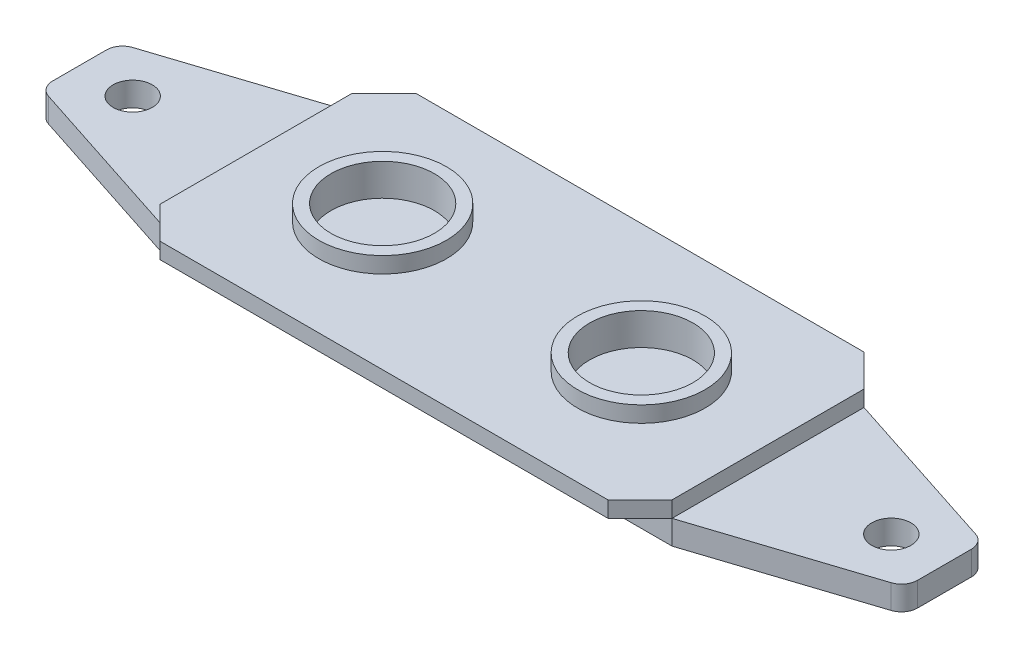
ISO-10303-21;
HEADER;
FILE_DESCRIPTION(('STEP AP214'),'2;1');
FILE_NAME('part.step','',(''),(''),'','','');
FILE_SCHEMA(('AUTOMOTIVE_DESIGN { 1 0 10303 214 1 1 1 1 }'));
ENDSEC;
DATA;
#1=APPLICATION_CONTEXT('core data for automotive mechanical design processes');
#2=APPLICATION_PROTOCOL_DEFINITION('international standard','automotive_design',2000,#1);
#3=PRODUCT_CONTEXT('',#1,'mechanical');
#4=PRODUCT('Part','Part','',(#3));
#5=PRODUCT_RELATED_PRODUCT_CATEGORY('part','',(#4));
#6=PRODUCT_DEFINITION_FORMATION('','',#4);
#7=PRODUCT_DEFINITION_CONTEXT('part definition',#1,'design');
#8=PRODUCT_DEFINITION('design','',#6,#7);
#9=PRODUCT_DEFINITION_SHAPE('','',#8);
#10=(LENGTH_UNIT() NAMED_UNIT(*) SI_UNIT(.MILLI.,.METRE.));
#11=(NAMED_UNIT(*) PLANE_ANGLE_UNIT() SI_UNIT($,.RADIAN.));
#12=(NAMED_UNIT(*) SI_UNIT($,.STERADIAN.) SOLID_ANGLE_UNIT());
#13=UNCERTAINTY_MEASURE_WITH_UNIT(LENGTH_MEASURE(1.E-05),#10,'distance_accuracy_value','');
#14=(GEOMETRIC_REPRESENTATION_CONTEXT(3) GLOBAL_UNCERTAINTY_ASSIGNED_CONTEXT((#13)) GLOBAL_UNIT_ASSIGNED_CONTEXT((#10,
#11,#12)) REPRESENTATION_CONTEXT('',''));
#15=CARTESIAN_POINT('',(0.,0.,0.));
#16=DIRECTION('',(0.,0.,1.));
#17=DIRECTION('',(1.,0.,0.));
#18=AXIS2_PLACEMENT_3D('',#15,#16,#17);
#19=CARTESIAN_POINT('',(0.,-3.175,-50.8));
#20=DIRECTION('',(0.,-1.,0.));
#21=DIRECTION('',(0.,0.,-1.));
#22=AXIS2_PLACEMENT_3D('',#19,#20,#21);
#23=PLANE('',#22);
#24=DIRECTION('',(-0.707106781186547,0.,-0.707106781186548));
#25=VECTOR('',#24,1.);
#26=CARTESIAN_POINT('',(95.25,-3.175,-50.8));
#27=LINE('',#26,#25);
#28=CARTESIAN_POINT('',(101.6,-3.175,-44.45));
#29=VERTEX_POINT('',#28);
#30=CARTESIAN_POINT('',(95.25,-3.175,-50.8));
#31=VERTEX_POINT('',#30);
#32=EDGE_CURVE('E120',#29,#31,#27,.T.);
#33=ORIENTED_EDGE('',*,*,#32,.F.);
#34=DIRECTION('',(-1.,0.,0.));
#35=VECTOR('',#34,1.);
#36=CARTESIAN_POINT('',(-86.0744696698032,-3.175,-44.45));
#37=LINE('',#36,#35);
#38=CARTESIAN_POINT('',(0.,-3.175,-44.45));
#39=VERTEX_POINT('',#38);
#40=EDGE_CURVE('E50',#29,#39,#37,.T.);
#41=ORIENTED_EDGE('',*,*,#40,.T.);
#42=DIRECTION('',(-0.707106781186547,0.,0.707106781186548));
#43=VECTOR('',#42,1.);
#44=CARTESIAN_POINT('',(0.,-3.175,-44.45));
#45=LINE('',#44,#43);
#46=CARTESIAN_POINT('',(6.35,-3.175,-50.8));
#47=VERTEX_POINT('',#46);
#48=EDGE_CURVE('E122',#47,#39,#45,.T.);
#49=ORIENTED_EDGE('',*,*,#48,.F.);
#50=DIRECTION('',(-1.,0.,0.));
#51=VECTOR('',#50,1.);
#52=CARTESIAN_POINT('',(6.35,-3.175,-50.8));
#53=LINE('',#52,#51);
#54=EDGE_CURVE('E112',#31,#47,#53,.T.);
#55=ORIENTED_EDGE('',*,*,#54,.F.);
#56=EDGE_LOOP('',(#33,#41,#49,#55));
#57=FACE_BOUND('',#56,.T.);
#58=ADVANCED_FACE('F33',(#57),#23,.T.);
#59=CARTESIAN_POINT('',(0.,0.,-50.8));
#60=DIRECTION('',(0.,-1.,0.));
#61=DIRECTION('',(0.,0.,-1.));
#62=AXIS2_PLACEMENT_3D('',#59,#60,#61);
#63=PLANE('',#62);
#64=DIRECTION('',(0.,0.,1.));
#65=VECTOR('',#64,1.);
#66=CARTESIAN_POINT('',(0.,0.,-6.35));
#67=LINE('',#66,#65);
#68=CARTESIAN_POINT('',(0.,0.,-44.45));
#69=VERTEX_POINT('',#68);
#70=CARTESIAN_POINT('',(0.,0.,-6.35));
#71=VERTEX_POINT('',#70);
#72=EDGE_CURVE('E133',#69,#71,#67,.T.);
#73=ORIENTED_EDGE('',*,*,#72,.T.);
#74=DIRECTION('',(0.707106781186547,0.,0.707106781186547));
#75=VECTOR('',#74,1.);
#76=CARTESIAN_POINT('',(0.,0.,-6.35));
#77=LINE('',#76,#75);
#78=CARTESIAN_POINT('',(6.35,0.,0.));
#79=VERTEX_POINT('',#78);
#80=EDGE_CURVE('E136',#71,#79,#77,.T.);
#81=ORIENTED_EDGE('',*,*,#80,.T.);
#82=DIRECTION('',(1.,0.,0.));
#83=VECTOR('',#82,1.);
#84=CARTESIAN_POINT('',(6.35,0.,0.));
#85=LINE('',#84,#83);
#86=CARTESIAN_POINT('',(95.25,0.,0.));
#87=VERTEX_POINT('',#86);
#88=EDGE_CURVE('E140',#79,#87,#85,.T.);
#89=ORIENTED_EDGE('',*,*,#88,.T.);
#90=DIRECTION('',(0.707106781186547,0.,-0.707106781186548));
#91=VECTOR('',#90,1.);
#92=CARTESIAN_POINT('',(95.25,0.,0.));
#93=LINE('',#92,#91);
#94=CARTESIAN_POINT('',(101.6,0.,-6.35));
#95=VERTEX_POINT('',#94);
#96=EDGE_CURVE('E143',#87,#95,#93,.T.);
#97=ORIENTED_EDGE('',*,*,#96,.T.);
#98=DIRECTION('',(0.,0.,-1.));
#99=VECTOR('',#98,1.);
#100=CARTESIAN_POINT('',(101.6,0.,-6.35));
#101=LINE('',#100,#99);
#102=CARTESIAN_POINT('',(101.6,0.,-44.45));
#103=VERTEX_POINT('',#102);
#104=EDGE_CURVE('E146',#95,#103,#101,.T.);
#105=ORIENTED_EDGE('',*,*,#104,.T.);
#106=DIRECTION('',(-0.707106781186547,0.,-0.707106781186548));
#107=VECTOR('',#106,1.);
#108=CARTESIAN_POINT('',(95.25,0.,-50.8));
#109=LINE('',#108,#107);
#110=CARTESIAN_POINT('',(95.25,0.,-50.8));
#111=VERTEX_POINT('',#110);
#112=EDGE_CURVE('E149',#103,#111,#109,.T.);
#113=ORIENTED_EDGE('',*,*,#112,.T.);
#114=DIRECTION('',(-1.,0.,0.));
#115=VECTOR('',#114,1.);
#116=CARTESIAN_POINT('',(6.35,0.,-50.8));
#117=LINE('',#116,#115);
#118=CARTESIAN_POINT('',(6.35,0.,-50.8));
#119=VERTEX_POINT('',#118);
#120=EDGE_CURVE('E113',#111,#119,#117,.T.);
#121=ORIENTED_EDGE('',*,*,#120,.T.);
#122=DIRECTION('',(-0.707106781186547,0.,0.707106781186548));
#123=VECTOR('',#122,1.);
#124=CARTESIAN_POINT('',(0.,0.,-44.45));
#125=LINE('',#124,#123);
#126=EDGE_CURVE('E152',#119,#69,#125,.T.);
#127=ORIENTED_EDGE('',*,*,#126,.T.);
#128=EDGE_LOOP('',(#73,#81,#89,#97,#105,#113,#121,#127));
#129=FACE_BOUND('',#128,.T.);
#130=CARTESIAN_POINT('',(25.1402808111057,0.,-25.4));
#131=DIRECTION('',(0.,-1.,0.));
#132=DIRECTION('',(0.,0.,-1.));
#133=AXIS2_PLACEMENT_3D('',#130,#131,#132);
#134=CIRCLE('',#133,12.6587947998545);
#135=CARTESIAN_POINT('',(25.1402808111057,0.,-38.0587947998545));
#136=VERTEX_POINT('',#135);
#137=EDGE_CURVE('E42',#136,#136,#134,.F.);
#138=ORIENTED_EDGE('',*,*,#137,.F.);
#139=EDGE_LOOP('',(#138));
#140=FACE_BOUND('',#139,.T.);
#141=CARTESIAN_POINT('',(76.4597191888943,0.,-25.4));
#142=DIRECTION('',(0.,-1.,0.));
#143=DIRECTION('',(0.,0.,-1.));
#144=AXIS2_PLACEMENT_3D('',#141,#142,#143);
#145=CIRCLE('',#144,12.6587947998545);
#146=CARTESIAN_POINT('',(76.4597191888943,0.,-38.0587947998545));
#147=VERTEX_POINT('',#146);
#148=EDGE_CURVE('E11',#147,#147,#145,.F.);
#149=ORIENTED_EDGE('',*,*,#148,.F.);
#150=EDGE_LOOP('',(#149));
#151=FACE_BOUND('',#150,.T.);
#152=ADVANCED_FACE('F169',(#129,#140,#151),#63,.F.);
#153=CARTESIAN_POINT('',(0.,-3.175,-6.35));
#154=DIRECTION('',(-1.,0.,0.));
#155=DIRECTION('',(0.,0.,1.));
#156=AXIS2_PLACEMENT_3D('',#153,#154,#155);
#157=PLANE('',#156);
#158=ORIENTED_EDGE('',*,*,#72,.F.);
#159=DIRECTION('',(0.,1.,0.));
#160=VECTOR('',#159,1.);
#161=CARTESIAN_POINT('',(0.,-3.175,-44.45));
#162=LINE('',#161,#160);
#163=EDGE_CURVE('E87',#39,#69,#162,.T.);
#164=ORIENTED_EDGE('',*,*,#163,.F.);
#165=DIRECTION('',(0.,0.,1.));
#166=VECTOR('',#165,1.);
#167=CARTESIAN_POINT('',(0.,-3.175,-6.35));
#168=LINE('',#167,#166);
#169=CARTESIAN_POINT('',(0.,-3.175,-6.35));
#170=VERTEX_POINT('',#169);
#171=EDGE_CURVE('E155',#39,#170,#168,.T.);
#172=ORIENTED_EDGE('',*,*,#171,.T.);
#173=DIRECTION('',(0.,1.,0.));
#174=VECTOR('',#173,1.);
#175=CARTESIAN_POINT('',(0.,-3.175,-6.35));
#176=LINE('',#175,#174);
#177=EDGE_CURVE('E132',#170,#71,#176,.T.);
#178=ORIENTED_EDGE('',*,*,#177,.T.);
#179=EDGE_LOOP('',(#158,#164,#172,#178));
#180=FACE_BOUND('',#179,.T.);
#181=ADVANCED_FACE('F35',(#180),#157,.T.);
#182=CARTESIAN_POINT('',(0.,-3.175,-44.45));
#183=DIRECTION('',(-0.707106781186548,0.,-0.707106781186547));
#184=DIRECTION('',(-0.707106781186547,0.,0.707106781186548));
#185=AXIS2_PLACEMENT_3D('',#182,#183,#184);
#186=PLANE('',#185);
#187=ORIENTED_EDGE('',*,*,#126,.F.);
#188=DIRECTION('',(0.,1.,0.));
#189=VECTOR('',#188,1.);
#190=CARTESIAN_POINT('',(6.35,-3.175,-50.8));
#191=LINE('',#190,#189);
#192=EDGE_CURVE('E80',#47,#119,#191,.T.);
#193=ORIENTED_EDGE('',*,*,#192,.F.);
#194=ORIENTED_EDGE('',*,*,#48,.T.);
#195=ORIENTED_EDGE('',*,*,#163,.T.);
#196=EDGE_LOOP('',(#187,#193,#194,#195));
#197=FACE_BOUND('',#196,.T.);
#198=ADVANCED_FACE('F575',(#197),#186,.T.);
#199=CARTESIAN_POINT('',(6.35,-3.175,-50.8));
#200=DIRECTION('',(0.,0.,-1.));
#201=DIRECTION('',(-1.,0.,0.));
#202=AXIS2_PLACEMENT_3D('',#199,#200,#201);
#203=PLANE('',#202);
#204=ORIENTED_EDGE('',*,*,#120,.F.);
#205=DIRECTION('',(0.,1.,0.));
#206=VECTOR('',#205,1.);
#207=CARTESIAN_POINT('',(95.25,-3.175,-50.8));
#208=LINE('',#207,#206);
#209=EDGE_CURVE('E109',#31,#111,#208,.T.);
#210=ORIENTED_EDGE('',*,*,#209,.F.);
#211=ORIENTED_EDGE('',*,*,#54,.T.);
#212=ORIENTED_EDGE('',*,*,#192,.T.);
#213=EDGE_LOOP('',(#204,#210,#211,#212));
#214=FACE_BOUND('',#213,.T.);
#215=ADVANCED_FACE('F111',(#214),#203,.T.);
#216=CARTESIAN_POINT('',(95.25,-3.175,-50.8));
#217=DIRECTION('',(0.707106781186548,0.,-0.707106781186547));
#218=DIRECTION('',(-0.707106781186547,0.,-0.707106781186548));
#219=AXIS2_PLACEMENT_3D('',#216,#217,#218);
#220=PLANE('',#219);
#221=ORIENTED_EDGE('',*,*,#112,.F.);
#222=DIRECTION('',(0.,1.,0.));
#223=VECTOR('',#222,1.);
#224=CARTESIAN_POINT('',(101.6,-3.175,-44.45));
#225=LINE('',#224,#223);
#226=EDGE_CURVE('E118',#29,#103,#225,.T.);
#227=ORIENTED_EDGE('',*,*,#226,.F.);
#228=ORIENTED_EDGE('',*,*,#32,.T.);
#229=ORIENTED_EDGE('',*,*,#209,.T.);
#230=EDGE_LOOP('',(#221,#227,#228,#229));
#231=FACE_BOUND('',#230,.T.);
#232=ADVANCED_FACE('F124',(#231),#220,.T.);
#233=CARTESIAN_POINT('',(101.6,-3.175,-6.35));
#234=DIRECTION('',(1.,0.,0.));
#235=DIRECTION('',(0.,0.,-1.));
#236=AXIS2_PLACEMENT_3D('',#233,#234,#235);
#237=PLANE('',#236);
#238=ORIENTED_EDGE('',*,*,#104,.F.);
#239=DIRECTION('',(0.,1.,0.));
#240=VECTOR('',#239,1.);
#241=CARTESIAN_POINT('',(101.6,-3.175,-6.35));
#242=LINE('',#241,#240);
#243=CARTESIAN_POINT('',(101.6,-3.175,-6.35));
#244=VERTEX_POINT('',#243);
#245=EDGE_CURVE('E159',#244,#95,#242,.T.);
#246=ORIENTED_EDGE('',*,*,#245,.F.);
#247=DIRECTION('',(0.,0.,-1.));
#248=VECTOR('',#247,1.);
#249=CARTESIAN_POINT('',(101.6,-3.175,-6.35));
#250=LINE('',#249,#248);
#251=EDGE_CURVE('E125',#244,#29,#250,.T.);
#252=ORIENTED_EDGE('',*,*,#251,.T.);
#253=ORIENTED_EDGE('',*,*,#226,.T.);
#254=EDGE_LOOP('',(#238,#246,#252,#253));
#255=FACE_BOUND('',#254,.T.);
#256=ADVANCED_FACE('F231',(#255),#237,.T.);
#257=CARTESIAN_POINT('',(95.25,-3.175,0.));
#258=DIRECTION('',(0.707106781186548,0.,0.707106781186547));
#259=DIRECTION('',(0.707106781186547,0.,-0.707106781186548));
#260=AXIS2_PLACEMENT_3D('',#257,#258,#259);
#261=PLANE('',#260);
#262=ORIENTED_EDGE('',*,*,#96,.F.);
#263=DIRECTION('',(0.,1.,0.));
#264=VECTOR('',#263,1.);
#265=CARTESIAN_POINT('',(95.25,-3.175,0.));
#266=LINE('',#265,#264);
#267=CARTESIAN_POINT('',(95.25,-3.175,0.));
#268=VERTEX_POINT('',#267);
#269=EDGE_CURVE('E161',#268,#87,#266,.T.);
#270=ORIENTED_EDGE('',*,*,#269,.F.);
#271=DIRECTION('',(0.707106781186547,0.,-0.707106781186548));
#272=VECTOR('',#271,1.);
#273=CARTESIAN_POINT('',(95.25,-3.175,0.));
#274=LINE('',#273,#272);
#275=EDGE_CURVE('E127',#268,#244,#274,.T.);
#276=ORIENTED_EDGE('',*,*,#275,.T.);
#277=ORIENTED_EDGE('',*,*,#245,.T.);
#278=EDGE_LOOP('',(#262,#270,#276,#277));
#279=FACE_BOUND('',#278,.T.);
#280=ADVANCED_FACE('F236',(#279),#261,.T.);
#281=CARTESIAN_POINT('',(6.35,-3.175,0.));
#282=DIRECTION('',(0.,0.,1.));
#283=DIRECTION('',(1.,0.,0.));
#284=AXIS2_PLACEMENT_3D('',#281,#282,#283);
#285=PLANE('',#284);
#286=ORIENTED_EDGE('',*,*,#88,.F.);
#287=DIRECTION('',(0.,1.,0.));
#288=VECTOR('',#287,1.);
#289=CARTESIAN_POINT('',(6.35,-3.175,0.));
#290=LINE('',#289,#288);
#291=CARTESIAN_POINT('',(6.35,-3.175,0.));
#292=VERTEX_POINT('',#291);
#293=EDGE_CURVE('E95',#292,#79,#290,.T.);
#294=ORIENTED_EDGE('',*,*,#293,.F.);
#295=DIRECTION('',(1.,0.,0.));
#296=VECTOR('',#295,1.);
#297=CARTESIAN_POINT('',(6.35,-3.175,0.));
#298=LINE('',#297,#296);
#299=EDGE_CURVE('E237',#292,#268,#298,.T.);
#300=ORIENTED_EDGE('',*,*,#299,.T.);
#301=ORIENTED_EDGE('',*,*,#269,.T.);
#302=EDGE_LOOP('',(#286,#294,#300,#301));
#303=FACE_BOUND('',#302,.T.);
#304=ADVANCED_FACE('F210',(#303),#285,.T.);
#305=CARTESIAN_POINT('',(0.,-3.175,-6.35));
#306=DIRECTION('',(-0.707106781186548,0.,0.707106781186548));
#307=DIRECTION('',(0.707106781186548,0.,0.707106781186548));
#308=AXIS2_PLACEMENT_3D('',#305,#306,#307);
#309=PLANE('',#308);
#310=ORIENTED_EDGE('',*,*,#80,.F.);
#311=ORIENTED_EDGE('',*,*,#177,.F.);
#312=DIRECTION('',(0.707106781186547,0.,0.707106781186547));
#313=VECTOR('',#312,1.);
#314=CARTESIAN_POINT('',(0.,-3.175,-6.35));
#315=LINE('',#314,#313);
#316=EDGE_CURVE('E220',#170,#292,#315,.T.);
#317=ORIENTED_EDGE('',*,*,#316,.T.);
#318=ORIENTED_EDGE('',*,*,#293,.T.);
#319=EDGE_LOOP('',(#310,#311,#317,#318));
#320=FACE_BOUND('',#319,.T.);
#321=ADVANCED_FACE('F202',(#320),#309,.T.);
#322=DIRECTION('',(-1.,0.,0.));
#323=VECTOR('',#322,1.);
#324=CARTESIAN_POINT('',(-86.0744696698032,-3.175,-6.35));
#325=LINE('',#324,#323);
#326=EDGE_CURVE('E215',#244,#170,#325,.T.);
#327=ORIENTED_EDGE('',*,*,#326,.F.);
#328=ORIENTED_EDGE('',*,*,#275,.F.);
#329=ORIENTED_EDGE('',*,*,#299,.F.);
#330=ORIENTED_EDGE('',*,*,#316,.F.);
#331=EDGE_LOOP('',(#327,#328,#329,#330));
#332=FACE_BOUND('',#331,.T.);
#333=ADVANCED_FACE('F196',(#332),#23,.T.);
#334=CARTESIAN_POINT('',(25.1402808111057,3.175,-25.4));
#335=DIRECTION('',(0.,1.,0.));
#336=DIRECTION('',(0.,0.,1.));
#337=AXIS2_PLACEMENT_3D('',#334,#335,#336);
#338=PLANE('',#337);
#339=CARTESIAN_POINT('',(25.1402808111057,3.175,-25.4));
#340=DIRECTION('',(0.,1.,0.));
#341=DIRECTION('',(0.,0.,1.));
#342=AXIS2_PLACEMENT_3D('',#339,#340,#341);
#343=CIRCLE('',#342,12.6587947998545);
#344=CARTESIAN_POINT('',(25.1402808111057,3.175,-12.7412052001455));
#345=VERTEX_POINT('',#344);
#346=EDGE_CURVE('E137',#345,#345,#343,.T.);
#347=ORIENTED_EDGE('',*,*,#346,.T.);
#348=EDGE_LOOP('',(#347));
#349=FACE_BOUND('',#348,.T.);
#350=CARTESIAN_POINT('',(25.1402808111057,3.175,-25.4));
#351=DIRECTION('',(0.,1.,0.));
#352=DIRECTION('',(0.,0.,1.));
#353=AXIS2_PLACEMENT_3D('',#350,#351,#352);
#354=CIRCLE('',#353,10.2638876755577);
#355=CARTESIAN_POINT('',(25.1402808111057,3.175,-15.1361123244423));
#356=VERTEX_POINT('',#355);
#357=EDGE_CURVE('E306',#356,#356,#354,.T.);
#358=ORIENTED_EDGE('',*,*,#357,.F.);
#359=EDGE_LOOP('',(#358));
#360=FACE_BOUND('',#359,.T.);
#361=ADVANCED_FACE('F201',(#349,#360),#338,.T.);
#362=CARTESIAN_POINT('',(25.1402808111057,3.175,-25.4));
#363=DIRECTION('',(0.,-1.,0.));
#364=DIRECTION('',(0.,0.,-1.));
#365=AXIS2_PLACEMENT_3D('',#362,#363,#364);
#366=CYLINDRICAL_SURFACE('',#365,12.6587947998545);
#367=ORIENTED_EDGE('',*,*,#346,.F.);
#368=EDGE_LOOP('',(#367));
#369=FACE_BOUND('',#368,.T.);
#370=ORIENTED_EDGE('',*,*,#137,.T.);
#371=EDGE_LOOP('',(#370));
#372=FACE_BOUND('',#371,.T.);
#373=ADVANCED_FACE('F167',(#369,#372),#366,.T.);
#374=CARTESIAN_POINT('',(25.1402808111057,3.175,-25.4));
#375=DIRECTION('',(0.,-1.,0.));
#376=DIRECTION('',(0.,0.,-1.));
#377=AXIS2_PLACEMENT_3D('',#374,#375,#376);
#378=CYLINDRICAL_SURFACE('',#377,10.2638876755577);
#379=ORIENTED_EDGE('',*,*,#357,.T.);
#380=EDGE_LOOP('',(#379));
#381=FACE_BOUND('',#380,.T.);
#382=CARTESIAN_POINT('',(25.1402808111057,-3.175,-25.4));
#383=DIRECTION('',(0.,1.,0.));
#384=DIRECTION('',(0.,0.,1.));
#385=AXIS2_PLACEMENT_3D('',#382,#383,#384);
#386=CIRCLE('',#385,10.2638876755577);
#387=CARTESIAN_POINT('',(25.1402808111057,-3.175,-15.1361123244423));
#388=VERTEX_POINT('',#387);
#389=EDGE_CURVE('E296',#388,#388,#386,.T.);
#390=ORIENTED_EDGE('',*,*,#389,.F.);
#391=EDGE_LOOP('',(#390));
#392=FACE_BOUND('',#391,.T.);
#393=ADVANCED_FACE('F189',(#381,#392),#378,.F.);
#394=CARTESIAN_POINT('',(76.4597191888943,3.175,-25.4));
#395=DIRECTION('',(0.,-1.,0.));
#396=DIRECTION('',(0.,0.,-1.));
#397=AXIS2_PLACEMENT_3D('',#394,#395,#396);
#398=PLANE('',#397);
#399=CARTESIAN_POINT('',(76.4597191888943,3.175,-25.4));
#400=DIRECTION('',(0.,1.,0.));
#401=DIRECTION('',(0.,0.,-1.));
#402=AXIS2_PLACEMENT_3D('',#399,#400,#401);
#403=CIRCLE('',#402,12.6587947998545);
#404=CARTESIAN_POINT('',(76.4597191888943,3.175,-38.0587947998545));
#405=VERTEX_POINT('',#404);
#406=EDGE_CURVE('E303',#405,#405,#403,.T.);
#407=ORIENTED_EDGE('',*,*,#406,.T.);
#408=EDGE_LOOP('',(#407));
#409=FACE_BOUND('',#408,.T.);
#410=CARTESIAN_POINT('',(76.4597191888943,3.175,-25.4));
#411=DIRECTION('',(0.,1.,0.));
#412=DIRECTION('',(0.,0.,-1.));
#413=AXIS2_PLACEMENT_3D('',#410,#411,#412);
#414=CIRCLE('',#413,10.2638876755577);
#415=CARTESIAN_POINT('',(76.4597191888943,3.175,-35.6638876755577));
#416=VERTEX_POINT('',#415);
#417=EDGE_CURVE('E300',#416,#416,#414,.T.);
#418=ORIENTED_EDGE('',*,*,#417,.F.);
#419=EDGE_LOOP('',(#418));
#420=FACE_BOUND('',#419,.T.);
#421=ADVANCED_FACE('F179',(#409,#420),#398,.F.);
#422=CARTESIAN_POINT('',(76.4597191888943,3.175,-25.4));
#423=DIRECTION('',(0.,-1.,0.));
#424=DIRECTION('',(0.,0.,-1.));
#425=AXIS2_PLACEMENT_3D('',#422,#423,#424);
#426=CYLINDRICAL_SURFACE('',#425,12.6587947998545);
#427=ORIENTED_EDGE('',*,*,#406,.F.);
#428=EDGE_LOOP('',(#427));
#429=FACE_BOUND('',#428,.T.);
#430=ORIENTED_EDGE('',*,*,#148,.T.);
#431=EDGE_LOOP('',(#430));
#432=FACE_BOUND('',#431,.T.);
#433=ADVANCED_FACE('F176',(#429,#432),#426,.T.);
#434=CARTESIAN_POINT('',(76.4597191888943,3.175,-25.4));
#435=DIRECTION('',(0.,-1.,0.));
#436=DIRECTION('',(0.,0.,-1.));
#437=AXIS2_PLACEMENT_3D('',#434,#435,#436);
#438=CYLINDRICAL_SURFACE('',#437,10.2638876755577);
#439=ORIENTED_EDGE('',*,*,#417,.T.);
#440=EDGE_LOOP('',(#439));
#441=FACE_BOUND('',#440,.T.);
#442=CARTESIAN_POINT('',(76.4597191888943,-3.175,-25.4));
#443=DIRECTION('',(0.,1.,0.));
#444=DIRECTION('',(0.,0.,1.));
#445=AXIS2_PLACEMENT_3D('',#442,#443,#444);
#446=CIRCLE('',#445,10.2638876755577);
#447=CARTESIAN_POINT('',(76.4597191888943,-3.175,-15.1361123244423));
#448=VERTEX_POINT('',#447);
#449=EDGE_CURVE('E293',#448,#448,#446,.T.);
#450=ORIENTED_EDGE('',*,*,#449,.F.);
#451=EDGE_LOOP('',(#450));
#452=FACE_BOUND('',#451,.T.);
#453=ADVANCED_FACE('F178',(#441,#452),#438,.F.);
#454=CARTESIAN_POINT('',(-86.0744696698032,-7.9502,-25.4));
#455=DIRECTION('',(0.,1.,0.));
#456=DIRECTION('',(0.,0.,1.));
#457=AXIS2_PLACEMENT_3D('',#454,#455,#456);
#458=PLANE('',#457);
#459=CARTESIAN_POINT('',(126.068509620757,-7.9502,-25.4));
#460=DIRECTION('',(0.,1.,0.));
#461=DIRECTION('',(0.,0.,1.));
#462=AXIS2_PLACEMENT_3D('',#459,#460,#461);
#463=CIRCLE('',#462,3.88887299707241);
#464=CARTESIAN_POINT('',(126.068509620757,-7.9502,-21.5111270029276));
#465=VERTEX_POINT('',#464);
#466=EDGE_CURVE('E439',#465,#465,#463,.T.);
#467=ORIENTED_EDGE('',*,*,#466,.T.);
#468=EDGE_LOOP('',(#467));
#469=FACE_BOUND('',#468,.T.);
#470=CARTESIAN_POINT('',(133.431100967663,-7.9502,-30.7469999752227));
#471=DIRECTION('',(0.,1.,0.));
#472=DIRECTION('',(0.,0.,1.));
#473=AXIS2_PLACEMENT_3D('',#470,#471,#472);
#474=CIRCLE('',#473,3.17500000000001);
#475=CARTESIAN_POINT('',(134.414065232922,-7.9502,-33.7660074699507));
#476=VERTEX_POINT('',#475);
#477=CARTESIAN_POINT('',(136.606100967663,-7.9502,-30.7469999752226));
#478=VERTEX_POINT('',#477);
#479=EDGE_CURVE('E443',#476,#478,#474,.F.);
#480=ORIENTED_EDGE('',*,*,#479,.T.);
#481=DIRECTION('',(0.,0.,-1.));
#482=VECTOR('',#481,1.);
#483=CARTESIAN_POINT('',(136.606100967663,-7.9502,-25.4));
#484=LINE('',#483,#482);
#485=CARTESIAN_POINT('',(136.606100967663,-7.9502,-20.0530000247774));
#486=VERTEX_POINT('',#485);
#487=EDGE_CURVE('E411',#486,#478,#484,.T.);
#488=ORIENTED_EDGE('',*,*,#487,.F.);
#489=CARTESIAN_POINT('',(133.431100967663,-7.9502,-20.0530000247773));
#490=DIRECTION('',(0.,1.,0.));
#491=DIRECTION('',(0.,0.,1.));
#492=AXIS2_PLACEMENT_3D('',#489,#490,#491);
#493=CIRCLE('',#492,3.17500000000001);
#494=CARTESIAN_POINT('',(134.414065232922,-7.9502,-17.0339925300493));
#495=VERTEX_POINT('',#494);
#496=EDGE_CURVE('E409',#495,#486,#493,.T.);
#497=ORIENTED_EDGE('',*,*,#496,.F.);
#498=DIRECTION('',(-0.950868502276543,0.,0.309595044176039));
#499=VECTOR('',#498,1.);
#500=CARTESIAN_POINT('',(-62.4780237248477,-7.9502,47.0724689132018));
#501=LINE('',#500,#499);
#502=CARTESIAN_POINT('',(101.6,-7.9502,-6.35));
#503=VERTEX_POINT('',#502);
#504=EDGE_CURVE('E407',#495,#503,#501,.T.);
#505=ORIENTED_EDGE('',*,*,#504,.T.);
#506=DIRECTION('',(-1.,0.,0.));
#507=VECTOR('',#506,1.);
#508=CARTESIAN_POINT('',(-86.0744696698032,-7.9502,-6.35));
#509=LINE('',#508,#507);
#510=CARTESIAN_POINT('',(0.,-7.9502,-6.35));
#511=VERTEX_POINT('',#510);
#512=EDGE_CURVE('E263',#503,#511,#509,.T.);
#513=ORIENTED_EDGE('',*,*,#512,.T.);
#514=DIRECTION('',(0.950868502276543,0.,0.309595044176039));
#515=VECTOR('',#514,1.);
#516=CARTESIAN_POINT('',(-83.4323285132668,-7.9502,-33.5148870163777));
#517=LINE('',#516,#515);
#518=CARTESIAN_POINT('',(-32.8140652329215,-7.9502,-17.0339925300493));
#519=VERTEX_POINT('',#518);
#520=EDGE_CURVE('E325',#519,#511,#517,.T.);
#521=ORIENTED_EDGE('',*,*,#520,.F.);
#522=CARTESIAN_POINT('',(-31.8311009676626,-7.9502,-20.0530000247773));
#523=DIRECTION('',(0.,1.,0.));
#524=DIRECTION('',(0.,0.,1.));
#525=AXIS2_PLACEMENT_3D('',#522,#523,#524);
#526=CIRCLE('',#525,3.17500000000001);
#527=CARTESIAN_POINT('',(-35.0061009676626,-7.9502,-20.0530000247774));
#528=VERTEX_POINT('',#527);
#529=EDGE_CURVE('E382',#519,#528,#526,.F.);
#530=ORIENTED_EDGE('',*,*,#529,.T.);
#531=DIRECTION('',(0.,0.,-1.));
#532=VECTOR('',#531,1.);
#533=CARTESIAN_POINT('',(-35.0061009676626,-7.9502,-25.4));
#534=LINE('',#533,#532);
#535=CARTESIAN_POINT('',(-35.0061009676626,-7.9502,-30.7469999752226));
#536=VERTEX_POINT('',#535);
#537=EDGE_CURVE('E387',#528,#536,#534,.T.);
#538=ORIENTED_EDGE('',*,*,#537,.T.);
#539=CARTESIAN_POINT('',(-31.8311009676626,-7.9502,-30.7469999752227));
#540=DIRECTION('',(0.,1.,0.));
#541=DIRECTION('',(0.,0.,1.));
#542=AXIS2_PLACEMENT_3D('',#539,#540,#541);
#543=CIRCLE('',#542,3.17500000000001);
#544=CARTESIAN_POINT('',(-32.8140652329215,-7.9502,-33.7660074699507));
#545=VERTEX_POINT('',#544);
#546=EDGE_CURVE('E399',#545,#536,#543,.T.);
#547=ORIENTED_EDGE('',*,*,#546,.F.);
#548=DIRECTION('',(0.950868502276543,0.,-0.309595044176039));
#549=VECTOR('',#548,1.);
#550=CARTESIAN_POINT('',(-83.4323285132668,-7.9502,-17.2851129836222));
#551=LINE('',#550,#549);
#552=CARTESIAN_POINT('',(0.,-7.9502,-44.45));
#553=VERTEX_POINT('',#552);
#554=EDGE_CURVE('E401',#545,#553,#551,.T.);
#555=ORIENTED_EDGE('',*,*,#554,.T.);
#556=DIRECTION('',(-1.,0.,0.));
#557=VECTOR('',#556,1.);
#558=CARTESIAN_POINT('',(-86.0744696698032,-7.9502,-44.45));
#559=LINE('',#558,#557);
#560=CARTESIAN_POINT('',(101.6,-7.9502,-44.45));
#561=VERTEX_POINT('',#560);
#562=EDGE_CURVE('E451',#561,#553,#559,.T.);
#563=ORIENTED_EDGE('',*,*,#562,.F.);
#564=DIRECTION('',(-0.950868502276543,0.,-0.309595044176039));
#565=VECTOR('',#564,1.);
#566=CARTESIAN_POINT('',(-62.4780237248477,-7.9502,-97.8724689132017));
#567=LINE('',#566,#565);
#568=EDGE_CURVE('E447',#476,#561,#567,.T.);
#569=ORIENTED_EDGE('',*,*,#568,.F.);
#570=EDGE_LOOP('',(#480,#488,#497,#505,#513,#521,#530,#538,#547,#555,#563,#569));
#571=FACE_BOUND('',#570,.T.);
#572=CARTESIAN_POINT('',(-24.4685096207567,-7.9502,-25.4));
#573=DIRECTION('',(0.,1.,0.));
#574=DIRECTION('',(0.,0.,1.));
#575=AXIS2_PLACEMENT_3D('',#572,#573,#574);
#576=CIRCLE('',#575,3.88887299707239);
#577=CARTESIAN_POINT('',(-24.4685096207567,-7.9502,-21.5111270029276));
#578=VERTEX_POINT('',#577);
#579=EDGE_CURVE('E292',#578,#578,#576,.F.);
#580=ORIENTED_EDGE('',*,*,#579,.F.);
#581=EDGE_LOOP('',(#580));
#582=FACE_BOUND('',#581,.T.);
#583=ADVANCED_FACE('F186',(#469,#571,#582),#458,.F.);
#584=CARTESIAN_POINT('',(-24.4685096207567,-7.9502,-25.4));
#585=DIRECTION('',(0.,1.,0.));
#586=DIRECTION('',(0.,0.,1.));
#587=AXIS2_PLACEMENT_3D('',#584,#585,#586);
#588=CYLINDRICAL_SURFACE('',#587,3.88887299707239);
#589=ORIENTED_EDGE('',*,*,#579,.T.);
#590=EDGE_LOOP('',(#589));
#591=FACE_BOUND('',#590,.T.);
#592=CARTESIAN_POINT('',(-24.4685096207567,-3.175,-25.4));
#593=DIRECTION('',(0.,1.,0.));
#594=DIRECTION('',(0.,0.,1.));
#595=AXIS2_PLACEMENT_3D('',#592,#593,#594);
#596=CIRCLE('',#595,3.88887299707239);
#597=CARTESIAN_POINT('',(-24.4685096207567,-3.175,-21.5111270029276));
#598=VERTEX_POINT('',#597);
#599=EDGE_CURVE('E436',#598,#598,#596,.F.);
#600=ORIENTED_EDGE('',*,*,#599,.F.);
#601=EDGE_LOOP('',(#600));
#602=FACE_BOUND('',#601,.T.);
#603=ADVANCED_FACE('F501',(#591,#602),#588,.F.);
#604=CARTESIAN_POINT('',(126.068509620757,-7.9502,-25.4));
#605=DIRECTION('',(0.,1.,0.));
#606=DIRECTION('',(0.,0.,1.));
#607=AXIS2_PLACEMENT_3D('',#604,#605,#606);
#608=CYLINDRICAL_SURFACE('',#607,3.88887299707241);
#609=ORIENTED_EDGE('',*,*,#466,.F.);
#610=EDGE_LOOP('',(#609));
#611=FACE_BOUND('',#610,.T.);
#612=CARTESIAN_POINT('',(126.068509620757,-3.175,-25.4));
#613=DIRECTION('',(0.,1.,0.));
#614=DIRECTION('',(0.,0.,1.));
#615=AXIS2_PLACEMENT_3D('',#612,#613,#614);
#616=CIRCLE('',#615,3.88887299707241);
#617=CARTESIAN_POINT('',(126.068509620757,-3.175,-21.5111270029276));
#618=VERTEX_POINT('',#617);
#619=EDGE_CURVE('E415',#618,#618,#616,.T.);
#620=ORIENTED_EDGE('',*,*,#619,.T.);
#621=EDGE_LOOP('',(#620));
#622=FACE_BOUND('',#621,.T.);
#623=ADVANCED_FACE('F497',(#611,#622),#608,.F.);
#624=CARTESIAN_POINT('',(-62.4780237248477,-7.9502,-97.8724689132017));
#625=DIRECTION('',(0.309595044176039,0.,-0.950868502276543));
#626=DIRECTION('',(-0.950868502276544,0.,-0.309595044176039));
#627=AXIS2_PLACEMENT_3D('',#624,#625,#626);
#628=PLANE('',#627);
#629=DIRECTION('',(-0.950868502276543,0.,-0.309595044176039));
#630=VECTOR('',#629,1.);
#631=CARTESIAN_POINT('',(-62.4780237248477,-3.175,-97.8724689132017));
#632=LINE('',#631,#630);
#633=CARTESIAN_POINT('',(134.414065232922,-3.175,-33.7660074699507));
#634=VERTEX_POINT('',#633);
#635=EDGE_CURVE('E248',#634,#29,#632,.T.);
#636=ORIENTED_EDGE('',*,*,#635,.F.);
#637=DIRECTION('',(0.,1.,0.));
#638=VECTOR('',#637,1.);
#639=CARTESIAN_POINT('',(134.414065232922,-7.9502,-33.7660074699507));
#640=LINE('',#639,#638);
#641=EDGE_CURVE('E289',#476,#634,#640,.T.);
#642=ORIENTED_EDGE('',*,*,#641,.F.);
#643=ORIENTED_EDGE('',*,*,#568,.T.);
#644=DIRECTION('',(0.,1.,0.));
#645=VECTOR('',#644,1.);
#646=CARTESIAN_POINT('',(101.6,-7.9502,-44.45));
#647=LINE('',#646,#645);
#648=EDGE_CURVE('E287',#561,#29,#647,.T.);
#649=ORIENTED_EDGE('',*,*,#648,.T.);
#650=EDGE_LOOP('',(#636,#642,#643,#649));
#651=FACE_BOUND('',#650,.T.);
#652=ADVANCED_FACE('F462',(#651),#628,.T.);
#653=CARTESIAN_POINT('',(-86.0744696698032,-7.9502,-44.45));
#654=DIRECTION('',(0.,0.,-1.));
#655=DIRECTION('',(-1.,0.,0.));
#656=AXIS2_PLACEMENT_3D('',#653,#654,#655);
#657=PLANE('',#656);
#658=ORIENTED_EDGE('',*,*,#40,.F.);
#659=ORIENTED_EDGE('',*,*,#648,.F.);
#660=ORIENTED_EDGE('',*,*,#562,.T.);
#661=DIRECTION('',(0.,1.,0.));
#662=VECTOR('',#661,1.);
#663=CARTESIAN_POINT('',(0.,-7.9502,-44.45));
#664=LINE('',#663,#662);
#665=EDGE_CURVE('E284',#553,#39,#664,.T.);
#666=ORIENTED_EDGE('',*,*,#665,.T.);
#667=EDGE_LOOP('',(#658,#659,#660,#666));
#668=FACE_BOUND('',#667,.T.);
#669=ADVANCED_FACE('F461',(#668),#657,.T.);
#670=CARTESIAN_POINT('',(-83.4323285132668,-7.9502,-17.2851129836222));
#671=DIRECTION('',(0.309595044176039,0.,0.950868502276543));
#672=DIRECTION('',(0.950868502276543,0.,-0.309595044176039));
#673=AXIS2_PLACEMENT_3D('',#670,#671,#672);
#674=PLANE('',#673);
#675=DIRECTION('',(0.950868502276543,0.,-0.309595044176039));
#676=VECTOR('',#675,1.);
#677=CARTESIAN_POINT('',(-83.4323285132668,-3.175,-17.2851129836222));
#678=LINE('',#677,#676);
#679=CARTESIAN_POINT('',(-32.8140652329215,-3.175,-33.7660074699507));
#680=VERTEX_POINT('',#679);
#681=EDGE_CURVE('E422',#680,#39,#678,.T.);
#682=ORIENTED_EDGE('',*,*,#681,.T.);
#683=ORIENTED_EDGE('',*,*,#665,.F.);
#684=ORIENTED_EDGE('',*,*,#554,.F.);
#685=DIRECTION('',(0.,1.,0.));
#686=VECTOR('',#685,1.);
#687=CARTESIAN_POINT('',(-32.8140652329215,-7.9502,-33.7660074699507));
#688=LINE('',#687,#686);
#689=EDGE_CURVE('E281',#545,#680,#688,.T.);
#690=ORIENTED_EDGE('',*,*,#689,.T.);
#691=EDGE_LOOP('',(#682,#683,#684,#690));
#692=FACE_BOUND('',#691,.T.);
#693=ADVANCED_FACE('F458',(#692),#674,.F.);
#694=CARTESIAN_POINT('',(-31.8311009676626,-7.9502,-30.7469999752227));
#695=DIRECTION('',(0.,1.,0.));
#696=DIRECTION('',(0.,0.,1.));
#697=AXIS2_PLACEMENT_3D('',#694,#695,#696);
#698=CYLINDRICAL_SURFACE('',#697,3.17500000000001);
#699=CARTESIAN_POINT('',(-31.8311009676626,-3.175,-30.7469999752227));
#700=DIRECTION('',(0.,1.,0.));
#701=DIRECTION('',(0.,0.,1.));
#702=AXIS2_PLACEMENT_3D('',#699,#700,#701);
#703=CIRCLE('',#702,3.17500000000001);
#704=CARTESIAN_POINT('',(-35.0061009676626,-3.175,-30.7469999752226));
#705=VERTEX_POINT('',#704);
#706=EDGE_CURVE('E425',#680,#705,#703,.T.);
#707=ORIENTED_EDGE('',*,*,#706,.F.);
#708=ORIENTED_EDGE('',*,*,#689,.F.);
#709=ORIENTED_EDGE('',*,*,#546,.T.);
#710=DIRECTION('',(0.,1.,0.));
#711=VECTOR('',#710,1.);
#712=CARTESIAN_POINT('',(-35.0061009676626,-7.9502,-30.7469999752226));
#713=LINE('',#712,#711);
#714=EDGE_CURVE('E278',#536,#705,#713,.T.);
#715=ORIENTED_EDGE('',*,*,#714,.T.);
#716=EDGE_LOOP('',(#707,#708,#709,#715));
#717=FACE_BOUND('',#716,.T.);
#718=ADVANCED_FACE('F487',(#717),#698,.T.);
#719=CARTESIAN_POINT('',(-35.0061009676626,-7.9502,-25.4));
#720=DIRECTION('',(1.,0.,0.));
#721=DIRECTION('',(0.,0.,-1.));
#722=AXIS2_PLACEMENT_3D('',#719,#720,#721);
#723=PLANE('',#722);
#724=DIRECTION('',(0.,0.,-1.));
#725=VECTOR('',#724,1.);
#726=CARTESIAN_POINT('',(-35.0061009676626,-3.175,-25.4));
#727=LINE('',#726,#725);
#728=CARTESIAN_POINT('',(-35.0061009676626,-3.175,-20.0530000247774));
#729=VERTEX_POINT('',#728);
#730=EDGE_CURVE('E428',#729,#705,#727,.T.);
#731=ORIENTED_EDGE('',*,*,#730,.T.);
#732=ORIENTED_EDGE('',*,*,#714,.F.);
#733=ORIENTED_EDGE('',*,*,#537,.F.);
#734=DIRECTION('',(0.,1.,0.));
#735=VECTOR('',#734,1.);
#736=CARTESIAN_POINT('',(-35.0061009676626,-7.9502,-20.0530000247774));
#737=LINE('',#736,#735);
#738=EDGE_CURVE('E275',#528,#729,#737,.T.);
#739=ORIENTED_EDGE('',*,*,#738,.T.);
#740=EDGE_LOOP('',(#731,#732,#733,#739));
#741=FACE_BOUND('',#740,.T.);
#742=ADVANCED_FACE('F397',(#741),#723,.F.);
#743=CARTESIAN_POINT('',(-31.8311009676626,-7.9502,-20.0530000247773));
#744=DIRECTION('',(0.,1.,0.));
#745=DIRECTION('',(0.,0.,1.));
#746=AXIS2_PLACEMENT_3D('',#743,#744,#745);
#747=CYLINDRICAL_SURFACE('',#746,3.17500000000001);
#748=CARTESIAN_POINT('',(-31.8311009676626,-3.175,-20.0530000247773));
#749=DIRECTION('',(0.,1.,0.));
#750=DIRECTION('',(0.,0.,1.));
#751=AXIS2_PLACEMENT_3D('',#748,#749,#750);
#752=CIRCLE('',#751,3.17500000000001);
#753=CARTESIAN_POINT('',(-32.8140652329215,-3.175,-17.0339925300493));
#754=VERTEX_POINT('',#753);
#755=EDGE_CURVE('E393',#754,#729,#752,.F.);
#756=ORIENTED_EDGE('',*,*,#755,.T.);
#757=ORIENTED_EDGE('',*,*,#738,.F.);
#758=ORIENTED_EDGE('',*,*,#529,.F.);
#759=DIRECTION('',(0.,1.,0.));
#760=VECTOR('',#759,1.);
#761=CARTESIAN_POINT('',(-32.8140652329215,-7.9502,-17.0339925300493));
#762=LINE('',#761,#760);
#763=EDGE_CURVE('E269',#519,#754,#762,.T.);
#764=ORIENTED_EDGE('',*,*,#763,.T.);
#765=EDGE_LOOP('',(#756,#757,#758,#764));
#766=FACE_BOUND('',#765,.T.);
#767=ADVANCED_FACE('F391',(#766),#747,.T.);
#768=CARTESIAN_POINT('',(-83.4323285132668,-7.9502,-33.5148870163777));
#769=DIRECTION('',(-0.309595044176039,0.,0.950868502276543));
#770=DIRECTION('',(0.950868502276543,0.,0.309595044176039));
#771=AXIS2_PLACEMENT_3D('',#768,#769,#770);
#772=PLANE('',#771);
#773=DIRECTION('',(0.950868502276543,0.,0.309595044176039));
#774=VECTOR('',#773,1.);
#775=CARTESIAN_POINT('',(-83.4323285132668,-3.175,-33.5148870163777));
#776=LINE('',#775,#774);
#777=EDGE_CURVE('E227',#754,#170,#776,.T.);
#778=ORIENTED_EDGE('',*,*,#777,.F.);
#779=ORIENTED_EDGE('',*,*,#763,.F.);
#780=ORIENTED_EDGE('',*,*,#520,.T.);
#781=DIRECTION('',(0.,1.,0.));
#782=VECTOR('',#781,1.);
#783=CARTESIAN_POINT('',(0.,-7.9502,-6.35));
#784=LINE('',#783,#782);
#785=EDGE_CURVE('E264',#511,#170,#784,.T.);
#786=ORIENTED_EDGE('',*,*,#785,.T.);
#787=EDGE_LOOP('',(#778,#779,#780,#786));
#788=FACE_BOUND('',#787,.T.);
#789=ADVANCED_FACE('F321',(#788),#772,.T.);
#790=CARTESIAN_POINT('',(-86.0744696698032,-7.9502,-6.35));
#791=DIRECTION('',(0.,0.,-1.));
#792=DIRECTION('',(-1.,0.,0.));
#793=AXIS2_PLACEMENT_3D('',#790,#791,#792);
#794=PLANE('',#793);
#795=ORIENTED_EDGE('',*,*,#326,.T.);
#796=ORIENTED_EDGE('',*,*,#785,.F.);
#797=ORIENTED_EDGE('',*,*,#512,.F.);
#798=DIRECTION('',(0.,1.,0.));
#799=VECTOR('',#798,1.);
#800=CARTESIAN_POINT('',(101.6,-7.9502,-6.35));
#801=LINE('',#800,#799);
#802=EDGE_CURVE('E255',#503,#244,#801,.T.);
#803=ORIENTED_EDGE('',*,*,#802,.T.);
#804=EDGE_LOOP('',(#795,#796,#797,#803));
#805=FACE_BOUND('',#804,.T.);
#806=ADVANCED_FACE('F261',(#805),#794,.F.);
#807=CARTESIAN_POINT('',(-62.4780237248477,-7.9502,47.0724689132018));
#808=DIRECTION('',(-0.309595044176039,0.,-0.950868502276543));
#809=DIRECTION('',(-0.950868502276543,0.,0.309595044176039));
#810=AXIS2_PLACEMENT_3D('',#807,#808,#809);
#811=PLANE('',#810);
#812=DIRECTION('',(-0.950868502276543,0.,0.309595044176039));
#813=VECTOR('',#812,1.);
#814=CARTESIAN_POINT('',(-62.4780237248477,-3.175,47.0724689132018));
#815=LINE('',#814,#813);
#816=CARTESIAN_POINT('',(134.414065232922,-3.175,-17.0339925300493));
#817=VERTEX_POINT('',#816);
#818=EDGE_CURVE('E226',#817,#244,#815,.T.);
#819=ORIENTED_EDGE('',*,*,#818,.T.);
#820=ORIENTED_EDGE('',*,*,#802,.F.);
#821=ORIENTED_EDGE('',*,*,#504,.F.);
#822=DIRECTION('',(0.,1.,0.));
#823=VECTOR('',#822,1.);
#824=CARTESIAN_POINT('',(134.414065232922,-7.9502,-17.0339925300493));
#825=LINE('',#824,#823);
#826=EDGE_CURVE('E258',#495,#817,#825,.T.);
#827=ORIENTED_EDGE('',*,*,#826,.T.);
#828=EDGE_LOOP('',(#819,#820,#821,#827));
#829=FACE_BOUND('',#828,.T.);
#830=ADVANCED_FACE('F252',(#829),#811,.F.);
#831=CARTESIAN_POINT('',(133.431100967663,-7.9502,-20.0530000247773));
#832=DIRECTION('',(0.,1.,0.));
#833=DIRECTION('',(0.,0.,1.));
#834=AXIS2_PLACEMENT_3D('',#831,#832,#833);
#835=CYLINDRICAL_SURFACE('',#834,3.17500000000001);
#836=CARTESIAN_POINT('',(133.431100967663,-3.175,-20.0530000247773));
#837=DIRECTION('',(0.,1.,0.));
#838=DIRECTION('',(0.,0.,1.));
#839=AXIS2_PLACEMENT_3D('',#836,#837,#838);
#840=CIRCLE('',#839,3.17500000000001);
#841=CARTESIAN_POINT('',(136.606100967663,-3.175,-20.0530000247774));
#842=VERTEX_POINT('',#841);
#843=EDGE_CURVE('E259',#817,#842,#840,.T.);
#844=ORIENTED_EDGE('',*,*,#843,.F.);
#845=ORIENTED_EDGE('',*,*,#826,.F.);
#846=ORIENTED_EDGE('',*,*,#496,.T.);
#847=DIRECTION('',(0.,1.,0.));
#848=VECTOR('',#847,1.);
#849=CARTESIAN_POINT('',(136.606100967663,-7.9502,-20.0530000247774));
#850=LINE('',#849,#848);
#851=EDGE_CURVE('E266',#486,#842,#850,.T.);
#852=ORIENTED_EDGE('',*,*,#851,.T.);
#853=EDGE_LOOP('',(#844,#845,#846,#852));
#854=FACE_BOUND('',#853,.T.);
#855=ADVANCED_FACE('F468',(#854),#835,.T.);
#856=CARTESIAN_POINT('',(136.606100967663,-7.9502,-25.4));
#857=DIRECTION('',(1.,0.,0.));
#858=DIRECTION('',(0.,0.,-1.));
#859=AXIS2_PLACEMENT_3D('',#856,#857,#858);
#860=PLANE('',#859);
#861=DIRECTION('',(0.,0.,-1.));
#862=VECTOR('',#861,1.);
#863=CARTESIAN_POINT('',(136.606100967663,-3.175,-25.4));
#864=LINE('',#863,#862);
#865=CARTESIAN_POINT('',(136.606100967663,-3.175,-30.7469999752226));
#866=VERTEX_POINT('',#865);
#867=EDGE_CURVE('E433',#842,#866,#864,.T.);
#868=ORIENTED_EDGE('',*,*,#867,.F.);
#869=ORIENTED_EDGE('',*,*,#851,.F.);
#870=ORIENTED_EDGE('',*,*,#487,.T.);
#871=DIRECTION('',(0.,1.,0.));
#872=VECTOR('',#871,1.);
#873=CARTESIAN_POINT('',(136.606100967663,-7.9502,-30.7469999752226));
#874=LINE('',#873,#872);
#875=EDGE_CURVE('E297',#478,#866,#874,.T.);
#876=ORIENTED_EDGE('',*,*,#875,.T.);
#877=EDGE_LOOP('',(#868,#869,#870,#876));
#878=FACE_BOUND('',#877,.T.);
#879=ADVANCED_FACE('F467',(#878),#860,.T.);
#880=CARTESIAN_POINT('',(133.431100967663,-7.9502,-30.7469999752227));
#881=DIRECTION('',(0.,1.,0.));
#882=DIRECTION('',(0.,0.,1.));
#883=AXIS2_PLACEMENT_3D('',#880,#881,#882);
#884=CYLINDRICAL_SURFACE('',#883,3.17500000000001);
#885=CARTESIAN_POINT('',(133.431100967663,-3.175,-30.7469999752227));
#886=DIRECTION('',(0.,1.,0.));
#887=DIRECTION('',(0.,0.,1.));
#888=AXIS2_PLACEMENT_3D('',#885,#886,#887);
#889=CIRCLE('',#888,3.17500000000001);
#890=EDGE_CURVE('E418',#634,#866,#889,.F.);
#891=ORIENTED_EDGE('',*,*,#890,.T.);
#892=ORIENTED_EDGE('',*,*,#875,.F.);
#893=ORIENTED_EDGE('',*,*,#479,.F.);
#894=ORIENTED_EDGE('',*,*,#641,.T.);
#895=EDGE_LOOP('',(#891,#892,#893,#894));
#896=FACE_BOUND('',#895,.T.);
#897=ADVANCED_FACE('F466',(#896),#884,.T.);
#898=CARTESIAN_POINT('',(-86.0744696698032,-3.175,-25.4));
#899=DIRECTION('',(0.,1.,0.));
#900=DIRECTION('',(0.,0.,1.));
#901=AXIS2_PLACEMENT_3D('',#898,#899,#900);
#902=PLANE('',#901);
#903=ORIENTED_EDGE('',*,*,#619,.F.);
#904=EDGE_LOOP('',(#903));
#905=FACE_BOUND('',#904,.T.);
#906=ORIENTED_EDGE('',*,*,#251,.F.);
#907=ORIENTED_EDGE('',*,*,#818,.F.);
#908=ORIENTED_EDGE('',*,*,#843,.T.);
#909=ORIENTED_EDGE('',*,*,#867,.T.);
#910=ORIENTED_EDGE('',*,*,#890,.F.);
#911=ORIENTED_EDGE('',*,*,#635,.T.);
#912=EDGE_LOOP('',(#906,#907,#908,#909,#910,#911));
#913=FACE_BOUND('',#912,.T.);
#914=ADVANCED_FACE('F242',(#905,#913),#902,.T.);
#915=ORIENTED_EDGE('',*,*,#599,.T.);
#916=EDGE_LOOP('',(#915));
#917=FACE_BOUND('',#916,.T.);
#918=ORIENTED_EDGE('',*,*,#171,.F.);
#919=ORIENTED_EDGE('',*,*,#681,.F.);
#920=ORIENTED_EDGE('',*,*,#706,.T.);
#921=ORIENTED_EDGE('',*,*,#730,.F.);
#922=ORIENTED_EDGE('',*,*,#755,.F.);
#923=ORIENTED_EDGE('',*,*,#777,.T.);
#924=EDGE_LOOP('',(#918,#919,#920,#921,#922,#923));
#925=FACE_BOUND('',#924,.T.);
#926=ADVANCED_FACE('F511',(#917,#925),#902,.T.);
#927=ORIENTED_EDGE('',*,*,#389,.T.);
#928=EDGE_LOOP('',(#927));
#929=FACE_BOUND('',#928,.T.);
#930=ADVANCED_FACE('F513',(#929),#902,.T.);
#931=ORIENTED_EDGE('',*,*,#449,.T.);
#932=EDGE_LOOP('',(#931));
#933=FACE_BOUND('',#932,.T.);
#934=ADVANCED_FACE('F517',(#933),#902,.T.);
#935=CLOSED_SHELL('',(#58,#152,#181,#198,#215,#232,#256,#280,#304,#321,#333,#361,#373,#393,#421,
#433,#453,#583,#603,#623,#652,#669,#693,#718,#742,#767,#789,#806,#830,#855,#879,#897,#914,#926,
#930,#934));
#936=MANIFOLD_SOLID_BREP('B2',#935);
#937=ADVANCED_BREP_SHAPE_REPRESENTATION('',(#18,#936),#14);
#938=SHAPE_DEFINITION_REPRESENTATION(#9,#937);
ENDSEC;
END-ISO-10303-21;
